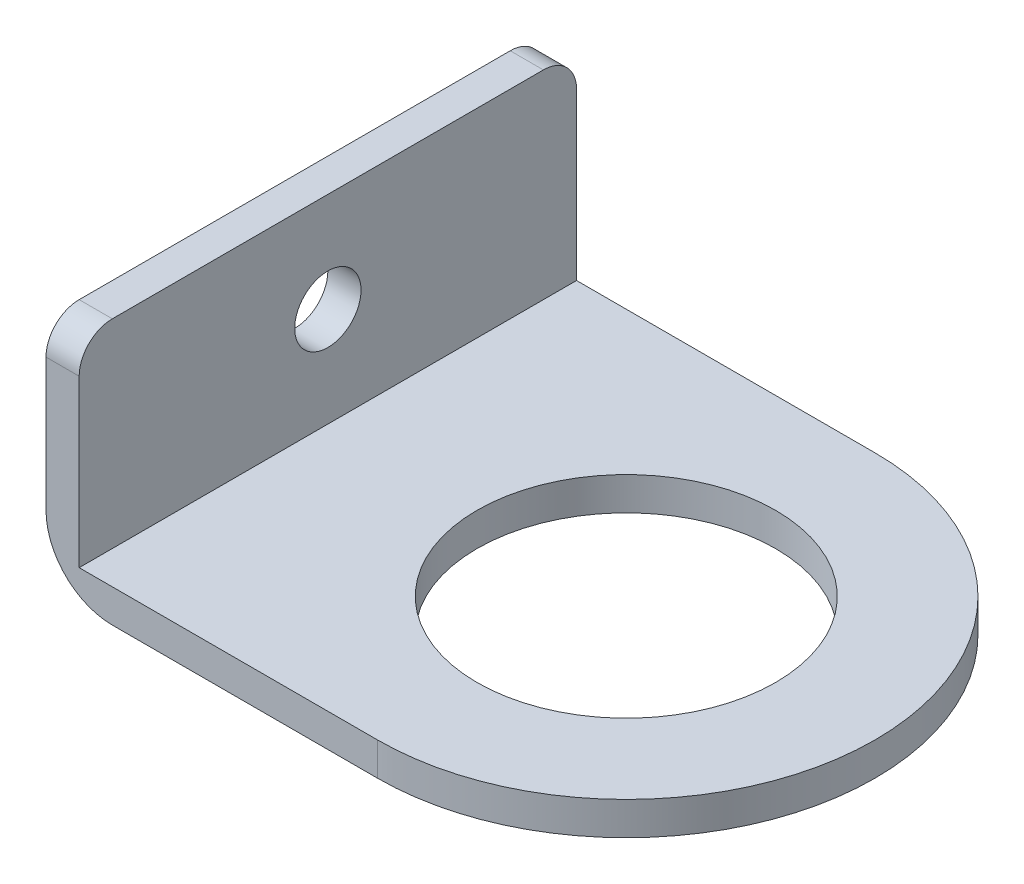
ISO-10303-21;
HEADER;
FILE_DESCRIPTION(('STEP AP214'),'2;1');
FILE_NAME('part.step','',(''),(''),'','','');
FILE_SCHEMA(('AUTOMOTIVE_DESIGN { 1 0 10303 214 1 1 1 1 }'));
ENDSEC;
DATA;
#1=APPLICATION_CONTEXT('core data for automotive mechanical design processes');
#2=APPLICATION_PROTOCOL_DEFINITION('international standard','automotive_design',2000,#1);
#3=PRODUCT_CONTEXT('',#1,'mechanical');
#4=PRODUCT('Part','Part','',(#3));
#5=PRODUCT_RELATED_PRODUCT_CATEGORY('part','',(#4));
#6=PRODUCT_DEFINITION_FORMATION('','',#4);
#7=PRODUCT_DEFINITION_CONTEXT('part definition',#1,'design');
#8=PRODUCT_DEFINITION('design','',#6,#7);
#9=PRODUCT_DEFINITION_SHAPE('','',#8);
#10=(LENGTH_UNIT() NAMED_UNIT(*) SI_UNIT(.MILLI.,.METRE.));
#11=(NAMED_UNIT(*) PLANE_ANGLE_UNIT() SI_UNIT($,.RADIAN.));
#12=(NAMED_UNIT(*) SI_UNIT($,.STERADIAN.) SOLID_ANGLE_UNIT());
#13=UNCERTAINTY_MEASURE_WITH_UNIT(LENGTH_MEASURE(1.E-05),#10,'distance_accuracy_value','');
#14=(GEOMETRIC_REPRESENTATION_CONTEXT(3) GLOBAL_UNCERTAINTY_ASSIGNED_CONTEXT((#13)) GLOBAL_UNIT_ASSIGNED_CONTEXT((#10,
#11,#12)) REPRESENTATION_CONTEXT('',''));
#15=CARTESIAN_POINT('',(0.,0.,0.));
#16=DIRECTION('',(0.,0.,1.));
#17=DIRECTION('',(1.,0.,0.));
#18=AXIS2_PLACEMENT_3D('',#15,#16,#17);
#19=CARTESIAN_POINT('',(0.,14.,-30.));
#20=DIRECTION('',(-1.,0.,0.));
#21=DIRECTION('',(0.,0.,1.));
#22=AXIS2_PLACEMENT_3D('',#19,#20,#21);
#23=PLANE('',#22);
#24=CARTESIAN_POINT('',(0.,8.,-15.));
#25=DIRECTION('',(-1.,0.,0.));
#26=DIRECTION('',(0.,0.,1.));
#27=AXIS2_PLACEMENT_3D('',#24,#25,#26);
#28=CIRCLE('',#27,2.);
#29=CARTESIAN_POINT('',(0.,8.,-17.));
#30=VERTEX_POINT('',#29);
#31=EDGE_CURVE('E197',#30,#30,#28,.T.);
#32=ORIENTED_EDGE('',*,*,#31,.F.);
#33=EDGE_LOOP('',(#32));
#34=FACE_BOUND('',#33,.T.);
#35=DIRECTION('',(0.,0.,1.));
#36=VECTOR('',#35,1.);
#37=CARTESIAN_POINT('',(0.,14.,-30.));
#38=LINE('',#37,#36);
#39=CARTESIAN_POINT('',(0.,14.,-28.));
#40=VERTEX_POINT('',#39);
#41=CARTESIAN_POINT('',(0.,14.,-2.));
#42=VERTEX_POINT('',#41);
#43=EDGE_CURVE('E169',#40,#42,#38,.T.);
#44=ORIENTED_EDGE('',*,*,#43,.F.);
#45=CARTESIAN_POINT('',(0.,12.,-28.));
#46=DIRECTION('',(-1.,0.,0.));
#47=DIRECTION('',(0.,0.,1.));
#48=AXIS2_PLACEMENT_3D('',#45,#46,#47);
#49=CIRCLE('',#48,2.);
#50=CARTESIAN_POINT('',(0.,12.,-30.));
#51=VERTEX_POINT('',#50);
#52=EDGE_CURVE('E207',#40,#51,#49,.T.);
#53=ORIENTED_EDGE('',*,*,#52,.T.);
#54=DIRECTION('',(0.,-1.,0.));
#55=VECTOR('',#54,1.);
#56=CARTESIAN_POINT('',(0.,14.,-30.));
#57=LINE('',#56,#55);
#58=CARTESIAN_POINT('',(0.,4.,-30.));
#59=VERTEX_POINT('',#58);
#60=EDGE_CURVE('E151',#51,#59,#57,.T.);
#61=ORIENTED_EDGE('',*,*,#60,.T.);
#62=DIRECTION('',(0.,0.,1.));
#63=VECTOR('',#62,1.);
#64=CARTESIAN_POINT('',(0.,4.,-30.));
#65=LINE('',#64,#63);
#66=CARTESIAN_POINT('',(0.,4.,0.));
#67=VERTEX_POINT('',#66);
#68=EDGE_CURVE('E173',#59,#67,#65,.T.);
#69=ORIENTED_EDGE('',*,*,#68,.T.);
#70=DIRECTION('',(0.,-1.,0.));
#71=VECTOR('',#70,1.);
#72=CARTESIAN_POINT('',(0.,14.,0.));
#73=LINE('',#72,#71);
#74=CARTESIAN_POINT('',(0.,12.,0.));
#75=VERTEX_POINT('',#74);
#76=EDGE_CURVE('E139',#75,#67,#73,.T.);
#77=ORIENTED_EDGE('',*,*,#76,.F.);
#78=CARTESIAN_POINT('',(0.,12.,-2.));
#79=DIRECTION('',(-1.,0.,0.));
#80=DIRECTION('',(0.,0.,1.));
#81=AXIS2_PLACEMENT_3D('',#78,#79,#80);
#82=CIRCLE('',#81,2.);
#83=EDGE_CURVE('E204',#75,#42,#82,.T.);
#84=ORIENTED_EDGE('',*,*,#83,.T.);
#85=EDGE_LOOP('',(#44,#53,#61,#69,#77,#84));
#86=FACE_BOUND('',#85,.T.);
#87=ADVANCED_FACE('F38',(#34,#86),#23,.T.);
#88=CARTESIAN_POINT('',(2.,14.,-30.));
#89=DIRECTION('',(0.,1.,0.));
#90=DIRECTION('',(0.,0.,1.));
#91=AXIS2_PLACEMENT_3D('',#88,#89,#90);
#92=PLANE('',#91);
#93=DIRECTION('',(0.,0.,1.));
#94=VECTOR('',#93,1.);
#95=CARTESIAN_POINT('',(2.,14.,-30.));
#96=LINE('',#95,#94);
#97=CARTESIAN_POINT('',(2.,14.,-28.));
#98=VERTEX_POINT('',#97);
#99=CARTESIAN_POINT('',(2.,14.,-2.));
#100=VERTEX_POINT('',#99);
#101=EDGE_CURVE('E174',#98,#100,#96,.T.);
#102=ORIENTED_EDGE('',*,*,#101,.F.);
#103=DIRECTION('',(-1.,0.,0.));
#104=VECTOR('',#103,1.);
#105=CARTESIAN_POINT('',(0.,14.,-28.));
#106=LINE('',#105,#104);
#107=EDGE_CURVE('E200',#98,#40,#106,.T.);
#108=ORIENTED_EDGE('',*,*,#107,.T.);
#109=ORIENTED_EDGE('',*,*,#43,.T.);
#110=DIRECTION('',(-1.,0.,0.));
#111=VECTOR('',#110,1.);
#112=CARTESIAN_POINT('',(2.,14.,-2.));
#113=LINE('',#112,#111);
#114=EDGE_CURVE('E192',#42,#100,#113,.F.);
#115=ORIENTED_EDGE('',*,*,#114,.T.);
#116=EDGE_LOOP('',(#102,#108,#109,#115));
#117=FACE_BOUND('',#116,.T.);
#118=ADVANCED_FACE('F220',(#117),#92,.T.);
#119=CARTESIAN_POINT('',(2.,1.99999999999999,-30.));
#120=DIRECTION('',(1.,0.,0.));
#121=DIRECTION('',(0.,1.,0.));
#122=AXIS2_PLACEMENT_3D('',#119,#120,#121);
#123=PLANE('',#122);
#124=CARTESIAN_POINT('',(2.,8.,-15.));
#125=DIRECTION('',(1.,0.,0.));
#126=DIRECTION('',(0.,1.,0.));
#127=AXIS2_PLACEMENT_3D('',#124,#125,#126);
#128=CIRCLE('',#127,2.);
#129=CARTESIAN_POINT('',(2.,8.,-17.));
#130=VERTEX_POINT('',#129);
#131=EDGE_CURVE('E193',#130,#130,#128,.T.);
#132=ORIENTED_EDGE('',*,*,#131,.F.);
#133=EDGE_LOOP('',(#132));
#134=FACE_BOUND('',#133,.T.);
#135=DIRECTION('',(0.,1.,0.));
#136=VECTOR('',#135,1.);
#137=CARTESIAN_POINT('',(2.,1.99999999999999,-30.));
#138=LINE('',#137,#136);
#139=CARTESIAN_POINT('',(2.,1.99999999999999,-30.));
#140=VERTEX_POINT('',#139);
#141=CARTESIAN_POINT('',(2.,12.,-30.));
#142=VERTEX_POINT('',#141);
#143=EDGE_CURVE('E119',#140,#142,#138,.T.);
#144=ORIENTED_EDGE('',*,*,#143,.T.);
#145=CARTESIAN_POINT('',(2.,12.,-28.));
#146=DIRECTION('',(1.,0.,0.));
#147=DIRECTION('',(0.,1.,0.));
#148=AXIS2_PLACEMENT_3D('',#145,#146,#147);
#149=CIRCLE('',#148,2.);
#150=EDGE_CURVE('E47',#142,#98,#149,.T.);
#151=ORIENTED_EDGE('',*,*,#150,.T.);
#152=ORIENTED_EDGE('',*,*,#101,.T.);
#153=CARTESIAN_POINT('',(2.,12.,-2.));
#154=DIRECTION('',(1.,0.,0.));
#155=DIRECTION('',(0.,1.,0.));
#156=AXIS2_PLACEMENT_3D('',#153,#154,#155);
#157=CIRCLE('',#156,2.);
#158=CARTESIAN_POINT('',(2.,12.,0.));
#159=VERTEX_POINT('',#158);
#160=EDGE_CURVE('E54',#100,#159,#157,.T.);
#161=ORIENTED_EDGE('',*,*,#160,.T.);
#162=DIRECTION('',(0.,1.,0.));
#163=VECTOR('',#162,1.);
#164=CARTESIAN_POINT('',(2.,1.99999999999999,0.));
#165=LINE('',#164,#163);
#166=CARTESIAN_POINT('',(2.,1.99999999999999,0.));
#167=VERTEX_POINT('',#166);
#168=EDGE_CURVE('E154',#167,#159,#165,.T.);
#169=ORIENTED_EDGE('',*,*,#168,.F.);
#170=DIRECTION('',(0.,0.,1.));
#171=VECTOR('',#170,1.);
#172=CARTESIAN_POINT('',(2.,1.99999999999999,-30.));
#173=LINE('',#172,#171);
#174=EDGE_CURVE('E158',#140,#167,#173,.T.);
#175=ORIENTED_EDGE('',*,*,#174,.F.);
#176=EDGE_LOOP('',(#144,#151,#152,#161,#169,#175));
#177=FACE_BOUND('',#176,.T.);
#178=ADVANCED_FACE('F216',(#134,#177),#123,.T.);
#179=CARTESIAN_POINT('',(20.,2.,-30.));
#180=DIRECTION('',(0.,1.,0.));
#181=DIRECTION('',(-1.,0.,0.));
#182=AXIS2_PLACEMENT_3D('',#179,#180,#181);
#183=PLANE('',#182);
#184=CARTESIAN_POINT('',(20.,2.,-15.));
#185=DIRECTION('',(0.,1.,0.));
#186=DIRECTION('',(-1.,0.,0.));
#187=AXIS2_PLACEMENT_3D('',#184,#185,#186);
#188=CIRCLE('',#187,9.);
#189=CARTESIAN_POINT('',(11.,2.,-15.));
#190=VERTEX_POINT('',#189);
#191=EDGE_CURVE('E148',#190,#190,#188,.T.);
#192=ORIENTED_EDGE('',*,*,#191,.F.);
#193=EDGE_LOOP('',(#192));
#194=FACE_BOUND('',#193,.T.);
#195=DIRECTION('',(-1.,0.,0.));
#196=VECTOR('',#195,1.);
#197=CARTESIAN_POINT('',(20.,2.,0.));
#198=LINE('',#197,#196);
#199=CARTESIAN_POINT('',(20.,2.,0.));
#200=VERTEX_POINT('',#199);
#201=EDGE_CURVE('E136',#200,#167,#198,.T.);
#202=ORIENTED_EDGE('',*,*,#201,.F.);
#203=CARTESIAN_POINT('',(20.,2.,-15.));
#204=DIRECTION('',(0.,-1.,0.));
#205=DIRECTION('',(0.,0.,-1.));
#206=AXIS2_PLACEMENT_3D('',#203,#204,#205);
#207=CIRCLE('',#206,15.);
#208=CARTESIAN_POINT('',(20.,2.,-30.));
#209=VERTEX_POINT('',#208);
#210=EDGE_CURVE('E127',#209,#200,#207,.T.);
#211=ORIENTED_EDGE('',*,*,#210,.F.);
#212=DIRECTION('',(-1.,0.,0.));
#213=VECTOR('',#212,1.);
#214=CARTESIAN_POINT('',(20.,2.,-30.));
#215=LINE('',#214,#213);
#216=EDGE_CURVE('E113',#209,#140,#215,.T.);
#217=ORIENTED_EDGE('',*,*,#216,.T.);
#218=ORIENTED_EDGE('',*,*,#174,.T.);
#219=EDGE_LOOP('',(#202,#211,#217,#218));
#220=FACE_BOUND('',#219,.T.);
#221=ADVANCED_FACE('F134',(#194,#220),#183,.T.);
#222=CARTESIAN_POINT('',(0.,0.,-30.));
#223=DIRECTION('',(0.,-1.,0.));
#224=DIRECTION('',(0.,0.,-1.));
#225=AXIS2_PLACEMENT_3D('',#222,#223,#224);
#226=PLANE('',#225);
#227=CARTESIAN_POINT('',(20.,0.,-15.));
#228=DIRECTION('',(0.,1.,0.));
#229=DIRECTION('',(-1.,0.,0.));
#230=AXIS2_PLACEMENT_3D('',#227,#228,#229);
#231=CIRCLE('',#230,9.);
#232=CARTESIAN_POINT('',(11.,0.,-15.));
#233=VERTEX_POINT('',#232);
#234=EDGE_CURVE('E145',#233,#233,#231,.T.);
#235=ORIENTED_EDGE('',*,*,#234,.T.);
#236=EDGE_LOOP('',(#235));
#237=FACE_BOUND('',#236,.T.);
#238=DIRECTION('',(1.,0.,0.));
#239=VECTOR('',#238,1.);
#240=CARTESIAN_POINT('',(0.,0.,0.));
#241=LINE('',#240,#239);
#242=CARTESIAN_POINT('',(4.,0.,0.));
#243=VERTEX_POINT('',#242);
#244=CARTESIAN_POINT('',(20.,0.,0.));
#245=VERTEX_POINT('',#244);
#246=EDGE_CURVE('E143',#243,#245,#241,.T.);
#247=ORIENTED_EDGE('',*,*,#246,.F.);
#248=DIRECTION('',(0.,0.,1.));
#249=VECTOR('',#248,1.);
#250=CARTESIAN_POINT('',(4.,0.,-30.));
#251=LINE('',#250,#249);
#252=CARTESIAN_POINT('',(4.,0.,-30.));
#253=VERTEX_POINT('',#252);
#254=EDGE_CURVE('E185',#243,#253,#251,.F.);
#255=ORIENTED_EDGE('',*,*,#254,.T.);
#256=DIRECTION('',(1.,0.,0.));
#257=VECTOR('',#256,1.);
#258=CARTESIAN_POINT('',(0.,0.,-30.));
#259=LINE('',#258,#257);
#260=CARTESIAN_POINT('',(20.,0.,-30.));
#261=VERTEX_POINT('',#260);
#262=EDGE_CURVE('E132',#253,#261,#259,.T.);
#263=ORIENTED_EDGE('',*,*,#262,.T.);
#264=CARTESIAN_POINT('',(20.,0.,-15.));
#265=DIRECTION('',(0.,-1.,0.));
#266=DIRECTION('',(0.,0.,-1.));
#267=AXIS2_PLACEMENT_3D('',#264,#265,#266);
#268=CIRCLE('',#267,15.);
#269=EDGE_CURVE('E130',#261,#245,#268,.T.);
#270=ORIENTED_EDGE('',*,*,#269,.T.);
#271=EDGE_LOOP('',(#247,#255,#263,#270));
#272=FACE_BOUND('',#271,.T.);
#273=ADVANCED_FACE('F253',(#237,#272),#226,.T.);
#274=CARTESIAN_POINT('',(0.,0.,-30.));
#275=DIRECTION('',(0.,0.,1.));
#276=DIRECTION('',(1.,0.,0.));
#277=AXIS2_PLACEMENT_3D('',#274,#275,#276);
#278=PLANE('',#277);
#279=ORIENTED_EDGE('',*,*,#60,.F.);
#280=DIRECTION('',(-1.,0.,0.));
#281=VECTOR('',#280,1.);
#282=CARTESIAN_POINT('',(2.,12.,-30.));
#283=LINE('',#282,#281);
#284=EDGE_CURVE('E62',#51,#142,#283,.F.);
#285=ORIENTED_EDGE('',*,*,#284,.T.);
#286=ORIENTED_EDGE('',*,*,#143,.F.);
#287=ORIENTED_EDGE('',*,*,#216,.F.);
#288=DIRECTION('',(0.,1.,0.));
#289=VECTOR('',#288,1.);
#290=CARTESIAN_POINT('',(20.,0.,-30.));
#291=LINE('',#290,#289);
#292=EDGE_CURVE('E117',#261,#209,#291,.T.);
#293=ORIENTED_EDGE('',*,*,#292,.F.);
#294=ORIENTED_EDGE('',*,*,#262,.F.);
#295=CARTESIAN_POINT('',(4.,4.,-30.));
#296=DIRECTION('',(0.,0.,1.));
#297=DIRECTION('',(1.,0.,0.));
#298=AXIS2_PLACEMENT_3D('',#295,#296,#297);
#299=CIRCLE('',#298,4.);
#300=EDGE_CURVE('E188',#253,#59,#299,.F.);
#301=ORIENTED_EDGE('',*,*,#300,.T.);
#302=EDGE_LOOP('',(#279,#285,#286,#287,#293,#294,#301));
#303=FACE_BOUND('',#302,.T.);
#304=ADVANCED_FACE('F115',(#303),#278,.F.);
#305=CARTESIAN_POINT('',(0.,0.,0.));
#306=DIRECTION('',(0.,0.,1.));
#307=DIRECTION('',(1.,0.,0.));
#308=AXIS2_PLACEMENT_3D('',#305,#306,#307);
#309=PLANE('',#308);
#310=ORIENTED_EDGE('',*,*,#168,.T.);
#311=DIRECTION('',(-1.,0.,0.));
#312=VECTOR('',#311,1.);
#313=CARTESIAN_POINT('',(0.,12.,0.));
#314=LINE('',#313,#312);
#315=EDGE_CURVE('E11',#159,#75,#314,.T.);
#316=ORIENTED_EDGE('',*,*,#315,.T.);
#317=ORIENTED_EDGE('',*,*,#76,.T.);
#318=CARTESIAN_POINT('',(4.,4.,0.));
#319=DIRECTION('',(0.,0.,1.));
#320=DIRECTION('',(1.,0.,0.));
#321=AXIS2_PLACEMENT_3D('',#318,#319,#320);
#322=CIRCLE('',#321,4.);
#323=EDGE_CURVE('E182',#67,#243,#322,.T.);
#324=ORIENTED_EDGE('',*,*,#323,.T.);
#325=ORIENTED_EDGE('',*,*,#246,.T.);
#326=DIRECTION('',(0.,1.,0.));
#327=VECTOR('',#326,1.);
#328=CARTESIAN_POINT('',(20.,0.,0.));
#329=LINE('',#328,#327);
#330=EDGE_CURVE('E162',#245,#200,#329,.T.);
#331=ORIENTED_EDGE('',*,*,#330,.T.);
#332=ORIENTED_EDGE('',*,*,#201,.T.);
#333=EDGE_LOOP('',(#310,#316,#317,#324,#325,#331,#332));
#334=FACE_BOUND('',#333,.T.);
#335=ADVANCED_FACE('F233',(#334),#309,.T.);
#336=CARTESIAN_POINT('',(20.,2.,-15.));
#337=DIRECTION('',(0.,-1.,0.));
#338=DIRECTION('',(0.,0.,-1.));
#339=AXIS2_PLACEMENT_3D('',#336,#337,#338);
#340=CYLINDRICAL_SURFACE('',#339,15.);
#341=ORIENTED_EDGE('',*,*,#269,.F.);
#342=ORIENTED_EDGE('',*,*,#292,.T.);
#343=ORIENTED_EDGE('',*,*,#210,.T.);
#344=ORIENTED_EDGE('',*,*,#330,.F.);
#345=EDGE_LOOP('',(#341,#342,#343,#344));
#346=FACE_BOUND('',#345,.T.);
#347=ADVANCED_FACE('F125',(#346),#340,.T.);
#348=CARTESIAN_POINT('',(20.,0.,-15.));
#349=DIRECTION('',(0.,1.,0.));
#350=DIRECTION('',(-1.,0.,0.));
#351=AXIS2_PLACEMENT_3D('',#348,#349,#350);
#352=CYLINDRICAL_SURFACE('',#351,9.);
#353=ORIENTED_EDGE('',*,*,#234,.F.);
#354=EDGE_LOOP('',(#353));
#355=FACE_BOUND('',#354,.T.);
#356=ORIENTED_EDGE('',*,*,#191,.T.);
#357=EDGE_LOOP('',(#356));
#358=FACE_BOUND('',#357,.T.);
#359=ADVANCED_FACE('F256',(#355,#358),#352,.F.);
#360=CARTESIAN_POINT('',(4.,4.,-30.));
#361=DIRECTION('',(0.,0.,1.));
#362=DIRECTION('',(1.,0.,0.));
#363=AXIS2_PLACEMENT_3D('',#360,#361,#362);
#364=CYLINDRICAL_SURFACE('',#363,4.);
#365=ORIENTED_EDGE('',*,*,#300,.F.);
#366=ORIENTED_EDGE('',*,*,#254,.F.);
#367=ORIENTED_EDGE('',*,*,#323,.F.);
#368=ORIENTED_EDGE('',*,*,#68,.F.);
#369=EDGE_LOOP('',(#365,#366,#367,#368));
#370=FACE_BOUND('',#369,.T.);
#371=ADVANCED_FACE('F230',(#370),#364,.T.);
#372=CARTESIAN_POINT('',(-1.2E-05,8.,-15.));
#373=DIRECTION('',(1.,0.,0.));
#374=DIRECTION('',(0.,0.,-1.));
#375=AXIS2_PLACEMENT_3D('',#372,#373,#374);
#376=CYLINDRICAL_SURFACE('',#375,2.);
#377=CARTESIAN_POINT('',(0.,8.,-17.));
#378=CARTESIAN_POINT('',(0.0208333333333333,8.,-17.));
#379=CARTESIAN_POINT('',(0.0416666666666667,8.,-17.));
#380=CARTESIAN_POINT('',(0.0833333333333334,8.,-17.));
#381=CARTESIAN_POINT('',(0.104166666666667,8.,-17.));
#382=CARTESIAN_POINT('',(0.145833333333333,8.,-17.));
#383=CARTESIAN_POINT('',(0.166666666666667,8.,-17.));
#384=CARTESIAN_POINT('',(0.208333333333333,8.,-17.));
#385=CARTESIAN_POINT('',(0.229166666666667,8.,-17.));
#386=CARTESIAN_POINT('',(0.270833333333333,8.,-17.));
#387=CARTESIAN_POINT('',(0.291666666666667,8.,-17.));
#388=CARTESIAN_POINT('',(0.333333333333333,8.,-17.));
#389=CARTESIAN_POINT('',(0.354166666666667,8.,-17.));
#390=CARTESIAN_POINT('',(0.395833333333334,8.,-17.));
#391=CARTESIAN_POINT('',(0.416666666666667,8.,-17.));
#392=CARTESIAN_POINT('',(0.458333333333334,8.,-17.));
#393=CARTESIAN_POINT('',(0.479166666666667,8.,-17.));
#394=CARTESIAN_POINT('',(0.520833333333334,8.,-17.));
#395=CARTESIAN_POINT('',(0.541666666666667,8.,-17.));
#396=CARTESIAN_POINT('',(0.583333333333334,8.,-17.));
#397=CARTESIAN_POINT('',(0.604166666666667,8.,-17.));
#398=CARTESIAN_POINT('',(0.645833333333334,8.,-17.));
#399=CARTESIAN_POINT('',(0.666666666666667,8.,-17.));
#400=CARTESIAN_POINT('',(0.708333333333334,8.,-17.));
#401=CARTESIAN_POINT('',(0.729166666666667,8.,-17.));
#402=CARTESIAN_POINT('',(0.770833333333334,8.,-17.));
#403=CARTESIAN_POINT('',(0.791666666666667,8.,-17.));
#404=CARTESIAN_POINT('',(0.833333333333334,8.,-17.));
#405=CARTESIAN_POINT('',(0.854166666666667,8.,-17.));
#406=CARTESIAN_POINT('',(0.895833333333334,8.,-17.));
#407=CARTESIAN_POINT('',(0.916666666666667,8.,-17.));
#408=CARTESIAN_POINT('',(0.958333333333334,8.,-17.));
#409=CARTESIAN_POINT('',(0.979166666666667,8.,-17.));
#410=CARTESIAN_POINT('',(1.02083333333333,8.,-17.));
#411=CARTESIAN_POINT('',(1.04166666666667,8.,-17.));
#412=CARTESIAN_POINT('',(1.08333333333333,8.,-17.));
#413=CARTESIAN_POINT('',(1.10416666666667,8.,-17.));
#414=CARTESIAN_POINT('',(1.14583333333333,8.,-17.));
#415=CARTESIAN_POINT('',(1.16666666666667,8.,-17.));
#416=CARTESIAN_POINT('',(1.20833333333333,8.,-17.));
#417=CARTESIAN_POINT('',(1.22916666666667,8.,-17.));
#418=CARTESIAN_POINT('',(1.27083333333333,8.,-17.));
#419=CARTESIAN_POINT('',(1.29166666666667,8.,-17.));
#420=CARTESIAN_POINT('',(1.33333333333333,8.,-17.));
#421=CARTESIAN_POINT('',(1.35416666666667,8.,-17.));
#422=CARTESIAN_POINT('',(1.39583333333333,8.,-17.));
#423=CARTESIAN_POINT('',(1.41666666666667,8.,-17.));
#424=CARTESIAN_POINT('',(1.45833333333333,8.,-17.));
#425=CARTESIAN_POINT('',(1.47916666666667,8.,-17.));
#426=CARTESIAN_POINT('',(1.52083333333333,8.,-17.));
#427=CARTESIAN_POINT('',(1.54166666666667,8.,-17.));
#428=CARTESIAN_POINT('',(1.58333333333333,8.,-17.));
#429=CARTESIAN_POINT('',(1.60416666666667,8.,-17.));
#430=CARTESIAN_POINT('',(1.64583333333333,8.,-17.));
#431=CARTESIAN_POINT('',(1.66666666666667,8.,-17.));
#432=CARTESIAN_POINT('',(1.70833333333333,8.,-17.));
#433=CARTESIAN_POINT('',(1.72916666666667,8.,-17.));
#434=CARTESIAN_POINT('',(1.77083333333333,8.,-17.));
#435=CARTESIAN_POINT('',(1.79166666666667,8.,-17.));
#436=CARTESIAN_POINT('',(1.83333333333333,8.,-17.));
#437=CARTESIAN_POINT('',(1.85416666666667,8.,-17.));
#438=CARTESIAN_POINT('',(1.89583333333333,8.,-17.));
#439=CARTESIAN_POINT('',(1.91666666666667,8.,-17.));
#440=CARTESIAN_POINT('',(1.95833333333333,8.,-17.));
#441=CARTESIAN_POINT('',(1.97916666666667,8.,-17.));
#442=CARTESIAN_POINT('',(2.,8.,-17.));
#443=B_SPLINE_CURVE_WITH_KNOTS('',3,(#377,#378,#379,#380,#381,#382,#383,#384,#385,#386,#387,
#388,#389,#390,#391,#392,#393,#394,#395,#396,#397,#398,#399,#400,#401,#402,#403,#404,#405,#406,
#407,#408,#409,#410,#411,#412,#413,#414,#415,#416,#417,#418,#419,#420,#421,#422,#423,#424,#425,
#426,#427,#428,#429,#430,#431,#432,#433,#434,#435,#436,#437,#438,#439,#440,#441,#442),
.UNSPECIFIED.,.F.,.F.,(4,2,2,2,2,2,2,2,2,2,2,2,2,2,2,2,2,2,2,2,2,2,2,2,2,2,2,2,2,2,2,2,4),(0.,
0.0625,0.125,0.1875,0.25,0.3125,0.375,0.4375,0.5,0.5625,0.625,0.6875,0.75,0.8125,0.875,
0.937500000000001,1.,1.0625,1.125,1.1875,1.25,1.3125,1.375,1.4375,1.5,1.5625,1.625,1.6875,1.75,
1.8125,1.875,1.9375,2.),.UNSPECIFIED.);
#444=EDGE_CURVE('BSEAM241',#30,#130,#443,.T.);
#445=ORIENTED_EDGE('',*,*,#31,.T.);
#446=ORIENTED_EDGE('',*,*,#131,.T.);
#447=ORIENTED_EDGE('',*,*,#444,.T.);
#448=ORIENTED_EDGE('',*,*,#444,.F.);
#449=EDGE_LOOP('',(#445,#447,#446,#448));
#450=FACE_BOUND('',#449,.T.);
#451=ADVANCED_FACE('F241',(#450),#376,.F.);
#452=CARTESIAN_POINT('',(2.,12.,-28.));
#453=DIRECTION('',(1.,0.,0.));
#454=DIRECTION('',(0.,0.,-1.));
#455=AXIS2_PLACEMENT_3D('',#452,#453,#454);
#456=CYLINDRICAL_SURFACE('',#455,2.);
#457=ORIENTED_EDGE('',*,*,#150,.F.);
#458=ORIENTED_EDGE('',*,*,#284,.F.);
#459=ORIENTED_EDGE('',*,*,#52,.F.);
#460=ORIENTED_EDGE('',*,*,#107,.F.);
#461=EDGE_LOOP('',(#457,#458,#459,#460));
#462=FACE_BOUND('',#461,.T.);
#463=ADVANCED_FACE('F223',(#462),#456,.T.);
#464=CARTESIAN_POINT('',(0.,12.,-2.));
#465=DIRECTION('',(-1.,0.,0.));
#466=DIRECTION('',(0.,0.,1.));
#467=AXIS2_PLACEMENT_3D('',#464,#465,#466);
#468=CYLINDRICAL_SURFACE('',#467,2.);
#469=ORIENTED_EDGE('',*,*,#160,.F.);
#470=ORIENTED_EDGE('',*,*,#114,.F.);
#471=ORIENTED_EDGE('',*,*,#83,.F.);
#472=ORIENTED_EDGE('',*,*,#315,.F.);
#473=EDGE_LOOP('',(#469,#470,#471,#472));
#474=FACE_BOUND('',#473,.T.);
#475=ADVANCED_FACE('F40',(#474),#468,.T.);
#476=CLOSED_SHELL('',(#87,#118,#178,#221,#273,#304,#335,#347,#359,#371,#451,#463,#475));
#477=MANIFOLD_SOLID_BREP('B2',#476);
#478=ADVANCED_BREP_SHAPE_REPRESENTATION('',(#18,#477),#14);
#479=SHAPE_DEFINITION_REPRESENTATION(#9,#478);
ENDSEC;
END-ISO-10303-21;
